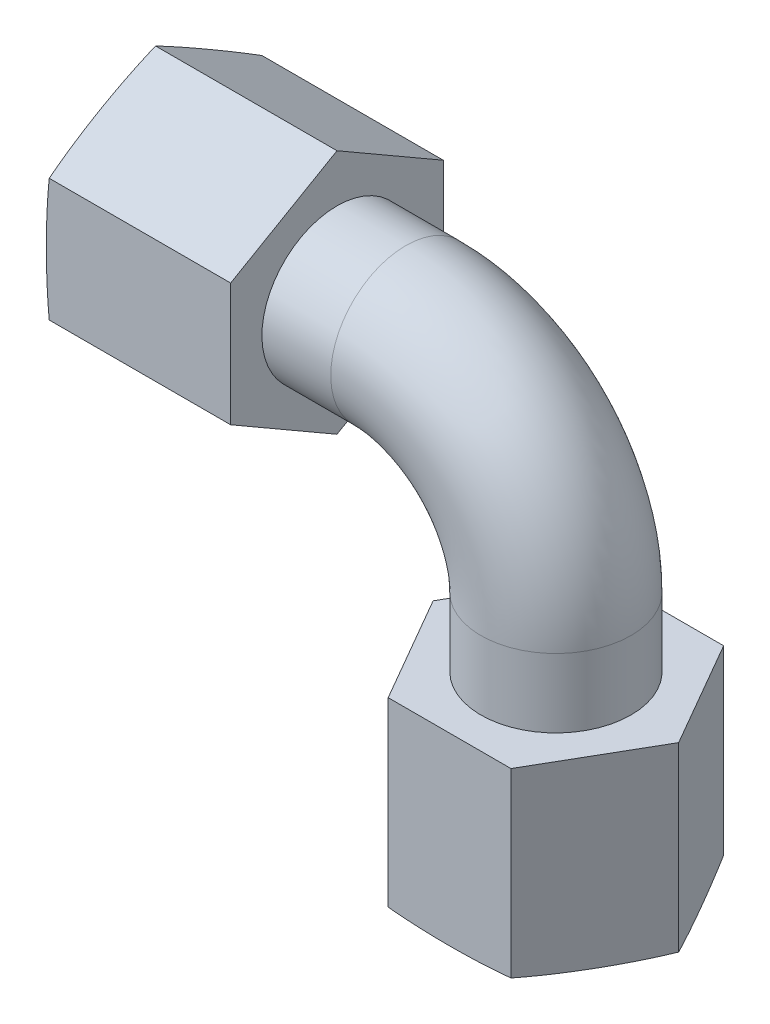
ISO-10303-21;
HEADER;
FILE_DESCRIPTION(('STEP AP214'),'2;1');
FILE_NAME('part.step','',(''),(''),'','','');
FILE_SCHEMA(('AUTOMOTIVE_DESIGN { 1 0 10303 214 1 1 1 1 }'));
ENDSEC;
DATA;
#1=APPLICATION_CONTEXT('core data for automotive mechanical design processes');
#2=APPLICATION_PROTOCOL_DEFINITION('international standard','automotive_design',2000,#1);
#3=PRODUCT_CONTEXT('',#1,'mechanical');
#4=PRODUCT('Part','Part','',(#3));
#5=PRODUCT_RELATED_PRODUCT_CATEGORY('part','',(#4));
#6=PRODUCT_DEFINITION_FORMATION('','',#4);
#7=PRODUCT_DEFINITION_CONTEXT('part definition',#1,'design');
#8=PRODUCT_DEFINITION('design','',#6,#7);
#9=PRODUCT_DEFINITION_SHAPE('','',#8);
#10=(LENGTH_UNIT() NAMED_UNIT(*) SI_UNIT(.MILLI.,.METRE.));
#11=(NAMED_UNIT(*) PLANE_ANGLE_UNIT() SI_UNIT($,.RADIAN.));
#12=(NAMED_UNIT(*) SI_UNIT($,.STERADIAN.) SOLID_ANGLE_UNIT());
#13=UNCERTAINTY_MEASURE_WITH_UNIT(LENGTH_MEASURE(1.E-05),#10,'distance_accuracy_value','');
#14=(GEOMETRIC_REPRESENTATION_CONTEXT(3) GLOBAL_UNCERTAINTY_ASSIGNED_CONTEXT((#13)) GLOBAL_UNIT_ASSIGNED_CONTEXT((#10,
#11,#12)) REPRESENTATION_CONTEXT('',''));
#15=CARTESIAN_POINT('',(0.,0.,0.));
#16=DIRECTION('',(0.,0.,1.));
#17=DIRECTION('',(1.,0.,0.));
#18=AXIS2_PLACEMENT_3D('',#15,#16,#17);
#19=CARTESIAN_POINT('',(2191.30773802744,1656.73988100521,8.77453151862028));
#20=DIRECTION('',(1.,0.,0.));
#21=DIRECTION('',(0.,1.,0.));
#22=AXIS2_PLACEMENT_3D('',#19,#20,#21);
#23=PLANE('',#22);
#24=CARTESIAN_POINT('',(2191.30773802744,1662.48988100521,8.77453151862028));
#25=DIRECTION('',(-1.,0.,0.));
#26=DIRECTION('',(0.,-1.,0.));
#27=AXIS2_PLACEMENT_3D('',#24,#25,#26);
#28=CIRCLE('',#27,4.);
#29=CARTESIAN_POINT('',(2191.30773802744,1658.48988100521,8.77453151862028));
#30=VERTEX_POINT('',#29);
#31=EDGE_CURVE('E620',#30,#30,#28,.T.);
#32=ORIENTED_EDGE('',*,*,#31,.T.);
#33=EDGE_LOOP('',(#32));
#34=FACE_BOUND('',#33,.T.);
#35=ADVANCED_FACE('F16',(#34),#23,.F.);
#36=CARTESIAN_POINT('',(2197.08303449311,1644.98988100521,8.77453151862028));
#37=DIRECTION('',(0.,1.,0.));
#38=DIRECTION('',(0.,0.,1.));
#39=AXIS2_PLACEMENT_3D('',#36,#37,#38);
#40=PLANE('',#39);
#41=CARTESIAN_POINT('',(2208.80773802744,1644.98988100521,8.77453151862028));
#42=DIRECTION('',(0.,1.,0.));
#43=DIRECTION('',(-1.,0.,0.));
#44=AXIS2_PLACEMENT_3D('',#41,#42,#43);
#45=CIRCLE('',#44,4.);
#46=CARTESIAN_POINT('',(2204.80773802744,1644.98988100521,8.77453151862028));
#47=VERTEX_POINT('',#46);
#48=EDGE_CURVE('E621',#47,#47,#45,.F.);
#49=ORIENTED_EDGE('',*,*,#48,.T.);
#50=EDGE_LOOP('',(#49));
#51=FACE_BOUND('',#50,.T.);
#52=ADVANCED_FACE('F582',(#51),#40,.F.);
#53=CARTESIAN_POINT('',(2191.30773802744,1662.48988100521,8.77453151862028));
#54=DIRECTION('',(-1.,0.,0.));
#55=DIRECTION('',(0.,-1.,0.));
#56=AXIS2_PLACEMENT_3D('',#53,#54,#55);
#57=CYLINDRICAL_SURFACE('',#56,4.);
#58=ORIENTED_EDGE('',*,*,#31,.F.);
#59=EDGE_LOOP('',(#58));
#60=FACE_BOUND('',#59,.T.);
#61=CARTESIAN_POINT('',(2176.30773802744,1662.48988100521,8.77453151862028));
#62=DIRECTION('',(-1.,0.,0.));
#63=DIRECTION('',(0.,-1.,0.));
#64=AXIS2_PLACEMENT_3D('',#61,#62,#63);
#65=CIRCLE('',#64,4.);
#66=CARTESIAN_POINT('',(2176.30773802744,1658.48988100521,8.77453151862028));
#67=VERTEX_POINT('',#66);
#68=EDGE_CURVE('E624',#67,#67,#65,.F.);
#69=ORIENTED_EDGE('',*,*,#68,.F.);
#70=EDGE_LOOP('',(#69));
#71=FACE_BOUND('',#70,.T.);
#72=ADVANCED_FACE('F573',(#60,#71),#57,.F.);
#73=CARTESIAN_POINT('',(2208.80773802744,1644.98988100521,8.77453151862028));
#74=DIRECTION('',(0.,1.,0.));
#75=DIRECTION('',(-1.,0.,0.));
#76=AXIS2_PLACEMENT_3D('',#73,#74,#75);
#77=CYLINDRICAL_SURFACE('',#76,4.);
#78=CARTESIAN_POINT('',(2208.80773802744,1629.98988100521,8.77453151862028));
#79=DIRECTION('',(0.,1.,0.));
#80=DIRECTION('',(-1.,0.,0.));
#81=AXIS2_PLACEMENT_3D('',#78,#79,#80);
#82=CIRCLE('',#81,4.);
#83=CARTESIAN_POINT('',(2204.80773802744,1629.98988100521,8.77453151862028));
#84=VERTEX_POINT('',#83);
#85=EDGE_CURVE('E645',#84,#84,#82,.T.);
#86=ORIENTED_EDGE('',*,*,#85,.F.);
#87=EDGE_LOOP('',(#86));
#88=FACE_BOUND('',#87,.T.);
#89=ORIENTED_EDGE('',*,*,#48,.F.);
#90=EDGE_LOOP('',(#89));
#91=FACE_BOUND('',#90,.T.);
#92=ADVANCED_FACE('F564',(#88,#91),#77,.F.);
#93=CARTESIAN_POINT('',(2176.30773802744,1662.48988100521,8.77453151862028));
#94=DIRECTION('',(-1.,0.,0.));
#95=DIRECTION('',(0.,-1.,0.));
#96=AXIS2_PLACEMENT_3D('',#93,#94,#95);
#97=PLANE('',#96);
#98=ORIENTED_EDGE('',*,*,#68,.T.);
#99=EDGE_LOOP('',(#98));
#100=FACE_BOUND('',#99,.T.);
#101=CARTESIAN_POINT('',(2176.30773802744,1662.48988100521,8.77453151862028));
#102=DIRECTION('',(1.,0.,0.));
#103=DIRECTION('',(0.,1.,0.));
#104=AXIS2_PLACEMENT_3D('',#101,#102,#103);
#105=CIRCLE('',#104,5.31495457622366);
#106=CARTESIAN_POINT('',(2176.30773802744,1657.17492642898,8.77453151862046));
#107=VERTEX_POINT('',#106);
#108=CARTESIAN_POINT('',(2176.30773802744,1667.80483558143,8.77453151862028));
#109=VERTEX_POINT('',#108);
#110=EDGE_CURVE('E642',#107,#109,#105,.F.);
#111=ORIENTED_EDGE('',*,*,#110,.T.);
#112=CARTESIAN_POINT('',(2176.30773802744,1662.48988100521,8.77453151862028));
#113=DIRECTION('',(1.,0.,0.));
#114=DIRECTION('',(0.,-1.,0.));
#115=AXIS2_PLACEMENT_3D('',#112,#113,#114);
#116=CIRCLE('',#115,5.31495457622344);
#117=EDGE_CURVE('E641',#109,#107,#116,.F.);
#118=ORIENTED_EDGE('',*,*,#117,.T.);
#119=EDGE_LOOP('',(#111,#118));
#120=FACE_BOUND('',#119,.T.);
#121=ADVANCED_FACE('F556',(#100,#120),#97,.T.);
#122=CARTESIAN_POINT('',(2208.80773802744,1629.98988100521,8.77453151862028));
#123=DIRECTION('',(0.,-1.,0.));
#124=DIRECTION('',(1.,0.,0.));
#125=AXIS2_PLACEMENT_3D('',#122,#123,#124);
#126=PLANE('',#125);
#127=ORIENTED_EDGE('',*,*,#85,.T.);
#128=EDGE_LOOP('',(#127));
#129=FACE_BOUND('',#128,.T.);
#130=CARTESIAN_POINT('',(2208.80773802744,1629.98988100521,8.77453151862028));
#131=DIRECTION('',(0.,1.,0.));
#132=DIRECTION('',(-1.,0.,0.));
#133=AXIS2_PLACEMENT_3D('',#130,#131,#132);
#134=CIRCLE('',#133,5.31495457622366);
#135=CARTESIAN_POINT('',(2214.12269260366,1629.98988100521,8.77453151862035));
#136=VERTEX_POINT('',#135);
#137=CARTESIAN_POINT('',(2203.49278345122,1629.98988100521,8.77453151862046));
#138=VERTEX_POINT('',#137);
#139=EDGE_CURVE('E126',#136,#138,#134,.F.);
#140=ORIENTED_EDGE('',*,*,#139,.T.);
#141=CARTESIAN_POINT('',(2208.80773802744,1629.98988100521,8.77453151862028));
#142=DIRECTION('',(0.,1.,0.));
#143=DIRECTION('',(1.,0.,0.));
#144=AXIS2_PLACEMENT_3D('',#141,#142,#143);
#145=CIRCLE('',#144,5.31495457622322);
#146=EDGE_CURVE('E631',#138,#136,#145,.F.);
#147=ORIENTED_EDGE('',*,*,#146,.T.);
#148=EDGE_LOOP('',(#140,#147));
#149=FACE_BOUND('',#148,.T.);
#150=ADVANCED_FACE('F222',(#129,#149),#126,.T.);
#151=CARTESIAN_POINT('',(2201.4047595833,1657.68570660186,8.77453151862028));
#152=DIRECTION('',(0.,0.,-1.));
#153=DIRECTION('',(0.,-1.,0.));
#154=AXIS2_PLACEMENT_3D('',#151,#152,#153);
#155=CIRCLE('',#154,25.1022187736506);
#156=TRIMMED_CURVE('',#155,(PARAMETER_VALUE(-1.76336880600803)),
(PARAMETER_VALUE(1.76336880600805)),.T.,.PARAMETER.);
#157=CARTESIAN_POINT('',(2201.4047595833,1662.48988100521,8.77453151862028));
#158=DIRECTION('',(-1.,0.,0.));
#159=AXIS1_PLACEMENT('',#157,#158);
#160=SURFACE_OF_REVOLUTION('',#156,#159);
#161=ORIENTED_EDGE('',*,*,#110,.F.);
#162=ORIENTED_EDGE('',*,*,#117,.F.);
#163=EDGE_LOOP('',(#161,#162));
#164=FACE_BOUND('',#163,.T.);
#165=CARTESIAN_POINT('',(2176.80773802744,1652.67492642899,8.77453151862075));
#166=CARTESIAN_POINT('',(2176.76522400836,1652.88372426442,8.41288305914125));
#167=CARTESIAN_POINT('',(2176.72945122882,1653.09284079154,8.05068260945429));
#168=CARTESIAN_POINT('',(2176.66992359423,1653.51146284025,7.32560795192809));
#169=CARTESIAN_POINT('',(2176.64616635151,1653.72096827623,6.96273389234122));
#170=CARTESIAN_POINT('',(2176.60923112416,1654.13973103752,6.23741551347061));
#171=CARTESIAN_POINT('',(2176.59602944363,1654.3489878596,5.87497206579601));
#172=CARTESIAN_POINT('',(2176.57909900616,1654.76761320342,5.14989170097483));
#173=CARTESIAN_POINT('',(2176.57537104585,1654.97698173306,4.78725477012275));
#174=CARTESIAN_POINT('',(2176.57702628768,1655.38611804952,4.07860988279533));
#175=CARTESIAN_POINT('',(2176.58199992867,1655.58588627245,3.73260117095429));
#176=CARTESIAN_POINT('',(2176.60067445799,1655.98530518785,3.04078731597354));
#177=CARTESIAN_POINT('',(2176.61437457738,1656.18495588913,2.69498215758475));
#178=CARTESIAN_POINT('',(2176.65147794116,1656.58446921215,2.00300478381755));
#179=CARTESIAN_POINT('',(2176.6749019882,1656.78433136634,1.6568333782484));
#180=CARTESIAN_POINT('',(2176.73274785697,1657.18369434716,0.965116404812906));
#181=CARTESIAN_POINT('',(2176.76717186569,1657.38319509399,0.619570975152987));
#182=CARTESIAN_POINT('',(2176.80773802744,1657.5824037171,0.27453151862084));
#183=B_SPLINE_CURVE_WITH_KNOTS('',3,(#165,#166,#167,#168,#169,#170,#171,#172,#173,#174,#175,
#176,#177,#178,#179,#180,#181,#182),.UNSPECIFIED.,.F.,.F.,(4,2,2,2,2,2,2,2,4),(0.,
1.25913729415697,2.51802428019885,3.77407722793103,5.03023579276556,6.22884943043978,
7.42735746790678,8.62844282993661,9.82976713873556),.UNSPECIFIED.);
#184=CARTESIAN_POINT('',(2176.80773802744,1652.67492642898,8.77453151862048));
#185=VERTEX_POINT('',#184);
#186=CARTESIAN_POINT('',(2176.80773802744,1657.5824037171,0.274531518620571));
#187=VERTEX_POINT('',#186);
#188=EDGE_CURVE('E135',#185,#187,#183,.T.);
#189=ORIENTED_EDGE('',*,*,#188,.F.);
#190=CARTESIAN_POINT('',(2176.80773802744,1657.5824037171,17.2745315186204));
#191=CARTESIAN_POINT('',(2176.76522400836,1657.37360588166,16.9128830591409));
#192=CARTESIAN_POINT('',(2176.72945122882,1657.16448935454,16.5506826094539));
#193=CARTESIAN_POINT('',(2176.66992359423,1656.74586730583,15.8256079519277));
#194=CARTESIAN_POINT('',(2176.64616635151,1656.53636186985,15.4627338923409));
#195=CARTESIAN_POINT('',(2176.60923112416,1656.11759910856,14.7374155134704));
#196=CARTESIAN_POINT('',(2176.59602944363,1655.90834228648,14.3749720657958));
#197=CARTESIAN_POINT('',(2176.57909900616,1655.48971694266,13.6498917009746));
#198=CARTESIAN_POINT('',(2176.57537104585,1655.28034841302,13.2872547701224));
#199=CARTESIAN_POINT('',(2176.57702628768,1654.87121209656,12.578609882795));
#200=CARTESIAN_POINT('',(2176.58199992867,1654.67144387364,12.2326011709541));
#201=CARTESIAN_POINT('',(2176.60067445799,1654.27202495823,11.5407873159733));
#202=CARTESIAN_POINT('',(2176.61437457738,1654.07237425695,11.1949821575844));
#203=CARTESIAN_POINT('',(2176.65147794116,1653.67286093393,10.5030047838171));
#204=CARTESIAN_POINT('',(2176.6749019882,1653.47299877974,10.156833378248));
#205=CARTESIAN_POINT('',(2176.73274785697,1653.07363579893,9.46511640481246));
#206=CARTESIAN_POINT('',(2176.76717186569,1652.87413505209,9.11957097515253));
#207=CARTESIAN_POINT('',(2176.80773802744,1652.67492642898,8.77453151862037));
#208=B_SPLINE_CURVE_WITH_KNOTS('',3,(#190,#191,#192,#193,#194,#195,#196,#197,#198,#199,#200,
#201,#202,#203,#204,#205,#206,#207),.UNSPECIFIED.,.F.,.F.,(4,2,2,2,2,2,2,2,4),(0.,
1.25913729415698,2.51802428019875,3.77407722793087,5.03023579276542,6.22884943043958,
7.42735746790682,8.62844282993664,9.82976713873575),.UNSPECIFIED.);
#209=CARTESIAN_POINT('',(2176.80773802744,1657.5824037171,17.2745315186203));
#210=VERTEX_POINT('',#209);
#211=EDGE_CURVE('E247',#210,#185,#208,.T.);
#212=ORIENTED_EDGE('',*,*,#211,.F.);
#213=CARTESIAN_POINT('',(2176.80773802744,1667.39735829332,17.2745315186202));
#214=CARTESIAN_POINT('',(2176.76522400836,1666.97976262245,17.2745315186203));
#215=CARTESIAN_POINT('',(2176.72945122882,1666.5615295682,17.2745315186203));
#216=CARTESIAN_POINT('',(2176.66992359423,1665.72428547079,17.2745315186203));
#217=CARTESIAN_POINT('',(2176.64616635151,1665.30527459882,17.2745315186203));
#218=CARTESIAN_POINT('',(2176.60923112416,1664.46774907624,17.2745315186203));
#219=CARTESIAN_POINT('',(2176.59602944363,1664.04923543208,17.2745315186203));
#220=CARTESIAN_POINT('',(2176.57909900616,1663.21198474445,17.2745315186203));
#221=CARTESIAN_POINT('',(2176.57537104585,1662.79324768516,17.2745315186203));
#222=CARTESIAN_POINT('',(2176.57702628768,1661.97497505224,17.2745315186203));
#223=CARTESIAN_POINT('',(2176.58199992867,1661.5754386064,17.2745315186203));
#224=CARTESIAN_POINT('',(2176.60067445799,1660.77660077559,17.2745315186203));
#225=CARTESIAN_POINT('',(2176.61437457738,1660.37729937303,17.2745315186203));
#226=CARTESIAN_POINT('',(2176.65147794116,1659.57827272699,17.2745315186203));
#227=CARTESIAN_POINT('',(2176.6749019882,1659.17854841861,17.2745315186203));
#228=CARTESIAN_POINT('',(2176.73274785697,1658.37982245698,17.2745315186203));
#229=CARTESIAN_POINT('',(2176.76717186569,1657.98082096332,17.2745315186202));
#230=CARTESIAN_POINT('',(2176.80773802744,1657.5824037171,17.2745315186201));
#231=B_SPLINE_CURVE_WITH_KNOTS('',3,(#213,#214,#215,#216,#217,#218,#219,#220,#221,#222,#223,
#224,#225,#226,#227,#228,#229,#230),.UNSPECIFIED.,.F.,.F.,(4,2,2,2,2,2,2,2,4),(0.,
1.25913729415702,2.51802428019896,3.77407722793127,5.0302357927657,6.22884943043954,
7.42735746790609,8.62844282993539,9.82976713873412),.UNSPECIFIED.);
#232=CARTESIAN_POINT('',(2176.80773802744,1667.39735829332,17.2745315186203));
#233=VERTEX_POINT('',#232);
#234=EDGE_CURVE('E241',#233,#210,#231,.T.);
#235=ORIENTED_EDGE('',*,*,#234,.F.);
#236=CARTESIAN_POINT('',(2176.80773802744,1672.30483558143,8.7745315186204));
#237=CARTESIAN_POINT('',(2176.76522400836,1672.096037746,9.1361799780999));
#238=CARTESIAN_POINT('',(2176.72945122882,1671.88692121887,9.49838042778687));
#239=CARTESIAN_POINT('',(2176.66992359423,1671.46829917017,10.2234550853131));
#240=CARTESIAN_POINT('',(2176.64616635151,1671.25879373418,10.5863291448999));
#241=CARTESIAN_POINT('',(2176.60923112416,1670.84003097289,11.3116475237705));
#242=CARTESIAN_POINT('',(2176.59602944363,1670.63077415081,11.6740909714451));
#243=CARTESIAN_POINT('',(2176.57909900616,1670.212148807,12.3991713362663));
#244=CARTESIAN_POINT('',(2176.57537104585,1670.00278027735,12.7618082671185));
#245=CARTESIAN_POINT('',(2176.57702628768,1669.59364396089,13.4704531544458));
#246=CARTESIAN_POINT('',(2176.58199992867,1669.39387573797,13.8164618662868));
#247=CARTESIAN_POINT('',(2176.60067445799,1668.99445682257,14.5082757212676));
#248=CARTESIAN_POINT('',(2176.61437457738,1668.79480612129,14.8540808796564));
#249=CARTESIAN_POINT('',(2176.65147794116,1668.39529279827,15.5460582534236));
#250=CARTESIAN_POINT('',(2176.6749019882,1668.19543064408,15.8922296589927));
#251=CARTESIAN_POINT('',(2176.73274785697,1667.79606766326,16.5839466324282));
#252=CARTESIAN_POINT('',(2176.76717186569,1667.59656691643,16.9294920620881));
#253=CARTESIAN_POINT('',(2176.80773802744,1667.39735829332,17.2745315186203));
#254=B_SPLINE_CURVE_WITH_KNOTS('',3,(#236,#237,#238,#239,#240,#241,#242,#243,#244,#245,#246,
#247,#248,#249,#250,#251,#252,#253),.UNSPECIFIED.,.F.,.F.,(4,2,2,2,2,2,2,2,4),(0.,
1.25913729415702,2.5180242801988,3.77407722793105,5.0302357927655,6.22884943043961,
7.42735746790682,8.6284428299366,9.82976713873555),.UNSPECIFIED.);
#255=CARTESIAN_POINT('',(2176.80773802744,1672.30483558143,8.77453151862034));
#256=VERTEX_POINT('',#255);
#257=EDGE_CURVE('E123',#256,#233,#254,.T.);
#258=ORIENTED_EDGE('',*,*,#257,.F.);
#259=CARTESIAN_POINT('',(2176.80773802744,1667.39735829332,0.274531518620019));
#260=CARTESIAN_POINT('',(2176.76522400836,1667.60615612875,0.636179978099561));
#261=CARTESIAN_POINT('',(2176.72945122882,1667.81527265588,0.99838042778656));
#262=CARTESIAN_POINT('',(2176.66992359423,1668.23389470459,1.72345508531276));
#263=CARTESIAN_POINT('',(2176.64616635151,1668.44340014057,2.0863291448996));
#264=CARTESIAN_POINT('',(2176.60923112416,1668.86216290186,2.81164752377012));
#265=CARTESIAN_POINT('',(2176.59602944363,1669.07141972394,3.17409097144466));
#266=CARTESIAN_POINT('',(2176.57909900616,1669.49004506775,3.89917133626584));
#267=CARTESIAN_POINT('',(2176.57537104585,1669.6994135974,4.26180826711798));
#268=CARTESIAN_POINT('',(2176.57702628768,1670.10854991386,4.97045315444545));
#269=CARTESIAN_POINT('',(2176.58199992867,1670.30831813678,5.3164618662865));
#270=CARTESIAN_POINT('',(2176.60067445799,1670.70773705218,6.00827572126724));
#271=CARTESIAN_POINT('',(2176.61437457738,1670.90738775347,6.35408087965603));
#272=CARTESIAN_POINT('',(2176.65147794116,1671.30690107648,7.04605825342326));
#273=CARTESIAN_POINT('',(2176.6749019882,1671.50676323067,7.39222965899244));
#274=CARTESIAN_POINT('',(2176.73274785697,1671.90612621149,8.08394663242805));
#275=CARTESIAN_POINT('',(2176.76717186569,1672.10562695832,8.42949206208804));
#276=CARTESIAN_POINT('',(2176.80773802744,1672.30483558143,8.77453151862023));
#277=B_SPLINE_CURVE_WITH_KNOTS('',3,(#259,#260,#261,#262,#263,#264,#265,#266,#267,#268,#269,
#270,#271,#272,#273,#274,#275,#276),.UNSPECIFIED.,.F.,.F.,(4,2,2,2,2,2,2,2,4),(0.,
1.25913729415706,2.51802428019885,3.77407722793094,5.03023579276543,6.22884943043967,
7.4273574679068,8.62844282993671,9.82976713873582),.UNSPECIFIED.);
#278=CARTESIAN_POINT('',(2176.80773802744,1667.39735829332,0.274531518620149));
#279=VERTEX_POINT('',#278);
#280=EDGE_CURVE('E116',#279,#256,#277,.T.);
#281=ORIENTED_EDGE('',*,*,#280,.F.);
#282=CARTESIAN_POINT('',(2176.80773802744,1657.5824037171,0.274531518620414));
#283=CARTESIAN_POINT('',(2176.76522400836,1657.99999938796,0.274531518620332));
#284=CARTESIAN_POINT('',(2176.72945122882,1658.41823244222,0.274531518620294));
#285=CARTESIAN_POINT('',(2176.66992359423,1659.25547653963,0.274531518620263));
#286=CARTESIAN_POINT('',(2176.64616635151,1659.6744874116,0.27453151862027));
#287=CARTESIAN_POINT('',(2176.60923112416,1660.51201293417,0.274531518620287));
#288=CARTESIAN_POINT('',(2176.59602944363,1660.93052657834,0.274531518620297));
#289=CARTESIAN_POINT('',(2176.57909900616,1661.76777726596,0.27453151862026));
#290=CARTESIAN_POINT('',(2176.57537104585,1662.18651432525,0.274531518620213));
#291=CARTESIAN_POINT('',(2176.57702628768,1663.00478695817,0.274531518620216));
#292=CARTESIAN_POINT('',(2176.58199992867,1663.40432340402,0.274531518620262));
#293=CARTESIAN_POINT('',(2176.60067445799,1664.20316123482,0.274531518620295));
#294=CARTESIAN_POINT('',(2176.61437457738,1664.60246263739,0.274531518620282));
#295=CARTESIAN_POINT('',(2176.65147794116,1665.40148928342,0.274531518620274));
#296=CARTESIAN_POINT('',(2176.6749019882,1665.8012135918,0.274531518620278));
#297=CARTESIAN_POINT('',(2176.73274785697,1666.59993955344,0.274531518620278));
#298=CARTESIAN_POINT('',(2176.76717186569,1666.9989410471,0.274531518620274));
#299=CARTESIAN_POINT('',(2176.80773802744,1667.39735829332,0.274531518620252));
#300=B_SPLINE_CURVE_WITH_KNOTS('',3,(#282,#283,#284,#285,#286,#287,#288,#289,#290,#291,#292,
#293,#294,#295,#296,#297,#298,#299),.UNSPECIFIED.,.F.,.F.,(4,2,2,2,2,2,2,2,4),(0.,
1.25913729415721,2.51802428019872,3.77407722793104,5.03023579276547,6.22884943043931,
7.42735746790652,8.62844282993627,9.82976713873544),.UNSPECIFIED.);
#301=EDGE_CURVE('E120',#187,#279,#300,.T.);
#302=ORIENTED_EDGE('',*,*,#301,.F.);
#303=EDGE_LOOP('',(#189,#212,#235,#258,#281,#302));
#304=FACE_BOUND('',#303,.T.);
#305=ADVANCED_FACE('F118',(#164,#304),#160,.T.);
#306=CARTESIAN_POINT('',(2204.00356362409,1655.08690256107,8.77453151862028));
#307=DIRECTION('',(0.,0.,1.));
#308=DIRECTION('',(-1.,0.,0.));
#309=AXIS2_PLACEMENT_3D('',#306,#307,#308);
#310=CIRCLE('',#309,25.1022187736506);
#311=TRIMMED_CURVE('',#310,(PARAMETER_VALUE(-1.76336880600805)),
(PARAMETER_VALUE(1.76336880600805)),.T.,.PARAMETER.);
#312=CARTESIAN_POINT('',(2208.80773802744,1655.08690256107,8.77453151862028));
#313=DIRECTION('',(0.,-1.,0.));
#314=AXIS1_PLACEMENT('',#312,#313);
#315=SURFACE_OF_REVOLUTION('',#311,#314);
#316=CARTESIAN_POINT('',(2198.99278345121,1630.48988100521,8.77453151862018));
#317=CARTESIAN_POINT('',(2199.20158128665,1630.44736698613,9.13617997809975));
#318=CARTESIAN_POINT('',(2199.41069781377,1630.41159420659,9.49838042778669));
#319=CARTESIAN_POINT('',(2199.82931986248,1630.352066572,10.2234550853128));
#320=CARTESIAN_POINT('',(2200.03882529846,1630.32830932928,10.5863291448996));
#321=CARTESIAN_POINT('',(2200.45758805975,1630.29137410193,11.3116475237701));
#322=CARTESIAN_POINT('',(2200.66684488183,1630.2781724214,11.6740909714447));
#323=CARTESIAN_POINT('',(2201.08547022565,1630.26124198393,12.3991713362659));
#324=CARTESIAN_POINT('',(2201.29483875529,1630.25751402363,12.7618082671182));
#325=CARTESIAN_POINT('',(2201.70397507175,1630.25916926545,13.4704531544456));
#326=CARTESIAN_POINT('',(2201.90374329468,1630.26414290644,13.8164618662865));
#327=CARTESIAN_POINT('',(2202.30316221008,1630.28281743576,14.5082757212673));
#328=CARTESIAN_POINT('',(2202.50281291136,1630.29651755516,14.8540808796563));
#329=CARTESIAN_POINT('',(2202.90232623438,1630.33362091893,15.5460582534236));
#330=CARTESIAN_POINT('',(2203.10218838857,1630.35704496598,15.8922296589927));
#331=CARTESIAN_POINT('',(2203.50155136939,1630.41489083475,16.5839466324282));
#332=CARTESIAN_POINT('',(2203.70105211622,1630.44931484347,16.9294920620881));
#333=CARTESIAN_POINT('',(2203.90026073933,1630.48988100521,17.2745315186205));
#334=B_SPLINE_CURVE_WITH_KNOTS('',3,(#316,#317,#318,#319,#320,#321,#322,#323,#324,#325,#326,
#327,#328,#329,#330,#331,#332,#333),.UNSPECIFIED.,.F.,.F.,(4,2,2,2,2,2,2,2,4),(0.,
1.25913729415684,2.51802428019878,3.7740772279307,5.03023579276534,6.22884943043973,
7.42735746790674,8.62844282993679,9.82976713873584),.UNSPECIFIED.);
#335=CARTESIAN_POINT('',(2198.99278345121,1630.48988100521,8.77453151862042));
#336=VERTEX_POINT('',#335);
#337=CARTESIAN_POINT('',(2203.90026073933,1630.48988100521,17.2745315186203));
#338=VERTEX_POINT('',#337);
#339=EDGE_CURVE('E282',#336,#338,#334,.T.);
#340=ORIENTED_EDGE('',*,*,#339,.F.);
#341=CARTESIAN_POINT('',(2203.90026073933,1630.48988100521,0.27453151862047));
#342=CARTESIAN_POINT('',(2203.69146290389,1630.44736698613,0.636179978099775));
#343=CARTESIAN_POINT('',(2203.48234637677,1630.41159420659,0.998380427786707));
#344=CARTESIAN_POINT('',(2203.06372432806,1630.352066572,1.72345508531293));
#345=CARTESIAN_POINT('',(2202.85421889208,1630.32830932928,2.08632914489986));
#346=CARTESIAN_POINT('',(2202.43545613079,1630.29137410193,2.81164752377048));
#347=CARTESIAN_POINT('',(2202.22619930871,1630.2781724214,3.17409097144505));
#348=CARTESIAN_POINT('',(2201.80757396489,1630.26124198393,3.89917133626624));
#349=CARTESIAN_POINT('',(2201.59820543525,1630.25751402363,4.26180826711836));
#350=CARTESIAN_POINT('',(2201.18906911879,1630.25916926545,4.97045315444587));
#351=CARTESIAN_POINT('',(2200.98930089587,1630.26414290644,5.31646186628697));
#352=CARTESIAN_POINT('',(2200.58988198046,1630.28281743576,6.00827572126773));
#353=CARTESIAN_POINT('',(2200.39023127918,1630.29651755516,6.3540808796565));
#354=CARTESIAN_POINT('',(2199.99071795616,1630.33362091893,7.04605825342369));
#355=CARTESIAN_POINT('',(2199.79085580197,1630.35704496597,7.39222965899286));
#356=CARTESIAN_POINT('',(2199.39149282116,1630.41489083475,8.08394663242843));
#357=CARTESIAN_POINT('',(2199.19199207432,1630.44931484347,8.4294920620884));
#358=CARTESIAN_POINT('',(2198.99278345121,1630.48988100521,8.77453151862066));
#359=B_SPLINE_CURVE_WITH_KNOTS('',3,(#341,#342,#343,#344,#345,#346,#347,#348,#349,#350,#351,
#352,#353,#354,#355,#356,#357,#358),.UNSPECIFIED.,.F.,.F.,(4,2,2,2,2,2,2,2,4),(0.,
1.25913729415689,2.51802428019871,3.77407722793104,5.03023579276549,6.22884943043983,
7.42735746790688,8.62844282993693,9.82976713873593),.UNSPECIFIED.);
#360=CARTESIAN_POINT('',(2203.90026073933,1630.48988100521,0.274531518620375));
#361=VERTEX_POINT('',#360);
#362=EDGE_CURVE('E291',#361,#336,#359,.T.);
#363=ORIENTED_EDGE('',*,*,#362,.F.);
#364=CARTESIAN_POINT('',(2213.71521531555,1630.48988100521,0.274531518620169));
#365=CARTESIAN_POINT('',(2213.29761964469,1630.44736698613,0.274531518620232));
#366=CARTESIAN_POINT('',(2212.87938659043,1630.41159420659,0.274531518620265));
#367=CARTESIAN_POINT('',(2212.04214249302,1630.352066572,0.274531518620294));
#368=CARTESIAN_POINT('',(2211.62313162105,1630.32830932928,0.27453151862029));
#369=CARTESIAN_POINT('',(2210.78560609847,1630.29137410193,0.274531518620269));
#370=CARTESIAN_POINT('',(2210.36709245431,1630.2781724214,0.274531518620253));
#371=CARTESIAN_POINT('',(2209.52984176668,1630.26124198393,0.274531518620306));
#372=CARTESIAN_POINT('',(2209.11110470739,1630.25751402363,0.274531518620376));
#373=CARTESIAN_POINT('',(2208.29283207448,1630.25916926545,0.274531518620372));
#374=CARTESIAN_POINT('',(2207.89329562863,1630.26414290644,0.274531518620305));
#375=CARTESIAN_POINT('',(2207.09445779782,1630.28281743576,0.274531518620253));
#376=CARTESIAN_POINT('',(2206.69515639526,1630.29651755516,0.274531518620269));
#377=CARTESIAN_POINT('',(2205.89612974922,1630.33362091893,0.27453151862029));
#378=CARTESIAN_POINT('',(2205.49640544084,1630.35704496598,0.274531518620296));
#379=CARTESIAN_POINT('',(2204.69767947921,1630.41489083475,0.274531518620262));
#380=CARTESIAN_POINT('',(2204.29867798555,1630.44931484347,0.274531518620223));
#381=CARTESIAN_POINT('',(2203.90026073933,1630.48988100521,0.274531518620141));
#382=B_SPLINE_CURVE_WITH_KNOTS('',3,(#364,#365,#366,#367,#368,#369,#370,#371,#372,#373,#374,
#375,#376,#377,#378,#379,#380,#381),.UNSPECIFIED.,.F.,.F.,(4,2,2,2,2,2,2,2,4),(0.,
1.2591372941568,2.51802428019896,3.77407722793082,5.0302357927657,6.22884943043977,
7.42735746790675,8.62844282993696,9.8297671387359),.UNSPECIFIED.);
#383=CARTESIAN_POINT('',(2213.71521531555,1630.48988100521,0.274531518620351));
#384=VERTEX_POINT('',#383);
#385=EDGE_CURVE('E299',#384,#361,#382,.T.);
#386=ORIENTED_EDGE('',*,*,#385,.F.);
#387=CARTESIAN_POINT('',(2218.62269260366,1630.48988100521,8.7745315186205));
#388=CARTESIAN_POINT('',(2218.41389476823,1630.44736698613,8.41288305914096));
#389=CARTESIAN_POINT('',(2218.2047782411,1630.41159420659,8.05068260945406));
#390=CARTESIAN_POINT('',(2217.7861561924,1630.352066572,7.32560795192801));
#391=CARTESIAN_POINT('',(2217.57665075641,1630.32830932928,6.96273389234121));
#392=CARTESIAN_POINT('',(2217.15788799512,1630.29137410193,6.2374155134707));
#393=CARTESIAN_POINT('',(2216.94863117304,1630.2781724214,5.87497206579612));
#394=CARTESIAN_POINT('',(2216.53000582923,1630.26124198393,5.14989170097478));
#395=CARTESIAN_POINT('',(2216.32063729958,1630.25751402363,4.78725477012252));
#396=CARTESIAN_POINT('',(2215.91150098312,1630.25916926545,4.07860988279506));
#397=CARTESIAN_POINT('',(2215.7117327602,1630.26414290644,3.73260117095413));
#398=CARTESIAN_POINT('',(2215.3123138448,1630.28281743576,3.04078731597342));
#399=CARTESIAN_POINT('',(2215.11266314352,1630.29651755516,2.69498215758453));
#400=CARTESIAN_POINT('',(2214.7131498205,1630.33362091893,2.00300478381717));
#401=CARTESIAN_POINT('',(2214.51328766631,1630.35704496598,1.65683337824797));
#402=CARTESIAN_POINT('',(2214.11392468549,1630.41489083475,0.965116404812473));
#403=CARTESIAN_POINT('',(2213.91442393866,1630.44931484347,0.619570975152619));
#404=CARTESIAN_POINT('',(2213.71521531555,1630.48988100521,0.274531518620483));
#405=B_SPLINE_CURVE_WITH_KNOTS('',3,(#387,#388,#389,#390,#391,#392,#393,#394,#395,#396,#397,
#398,#399,#400,#401,#402,#403,#404),.UNSPECIFIED.,.F.,.F.,(4,2,2,2,2,2,2,2,4),(0.,
1.25913729415675,2.51802428019862,3.77407722793064,5.03023579276535,6.22884943043972,
7.42735746790665,8.62844282993684,9.82976713873578),.UNSPECIFIED.);
#406=CARTESIAN_POINT('',(2218.62269260366,1630.48988100521,8.77453151862056));
#407=VERTEX_POINT('',#406);
#408=EDGE_CURVE('E322',#407,#384,#405,.T.);
#409=ORIENTED_EDGE('',*,*,#408,.F.);
#410=CARTESIAN_POINT('',(2213.71521531555,1630.48988100521,17.2745315186204));
#411=CARTESIAN_POINT('',(2213.92401315098,1630.44736698613,16.9128830591409));
#412=CARTESIAN_POINT('',(2214.13312967811,1630.41159420659,16.550682609454));
#413=CARTESIAN_POINT('',(2214.55175172681,1630.352066572,15.8256079519279));
#414=CARTESIAN_POINT('',(2214.7612571628,1630.32830932928,15.4627338923411));
#415=CARTESIAN_POINT('',(2215.18001992409,1630.29137410193,14.7374155134706));
#416=CARTESIAN_POINT('',(2215.38927674617,1630.2781724214,14.374972065796));
#417=CARTESIAN_POINT('',(2215.80790208998,1630.26124198393,13.6498917009746));
#418=CARTESIAN_POINT('',(2216.01727061963,1630.25751402363,13.2872547701223));
#419=CARTESIAN_POINT('',(2216.42640693609,1630.25916926545,12.5786098827949));
#420=CARTESIAN_POINT('',(2216.62617515901,1630.26414290644,12.2326011709541));
#421=CARTESIAN_POINT('',(2217.02559407441,1630.28281743576,11.5407873159735));
#422=CARTESIAN_POINT('',(2217.2252447757,1630.29651755516,11.1949821575847));
#423=CARTESIAN_POINT('',(2217.62475809871,1630.33362091893,10.5030047838175));
#424=CARTESIAN_POINT('',(2217.8246202529,1630.35704496597,10.1568333782484));
#425=CARTESIAN_POINT('',(2218.22398323372,1630.41489083475,9.46511640481296));
#426=CARTESIAN_POINT('',(2218.42348398055,1630.44931484347,9.11957097515302));
#427=CARTESIAN_POINT('',(2218.62269260366,1630.48988100521,8.77453151862069));
#428=B_SPLINE_CURVE_WITH_KNOTS('',3,(#410,#411,#412,#413,#414,#415,#416,#417,#418,#419,#420,
#421,#422,#423,#424,#425,#426,#427),.UNSPECIFIED.,.F.,.F.,(4,2,2,2,2,2,2,2,4),(0.,
1.25913729415675,2.51802428019865,3.77407722793071,5.03023579276546,6.22884943043962,
7.42735746790637,8.62844282993631,9.8297671387353),.UNSPECIFIED.);
#429=CARTESIAN_POINT('',(2213.71521531555,1630.48988100521,17.2745315186204));
#430=VERTEX_POINT('',#429);
#431=EDGE_CURVE('E331',#430,#407,#428,.T.);
#432=ORIENTED_EDGE('',*,*,#431,.F.);
#433=CARTESIAN_POINT('',(2203.90026073933,1630.48988100521,17.2745315186202));
#434=CARTESIAN_POINT('',(2204.31785641019,1630.44736698613,17.2745315186203));
#435=CARTESIAN_POINT('',(2204.73608946445,1630.41159420659,17.2745315186203));
#436=CARTESIAN_POINT('',(2205.57333356186,1630.352066572,17.2745315186203));
#437=CARTESIAN_POINT('',(2205.99234443383,1630.32830932928,17.2745315186203));
#438=CARTESIAN_POINT('',(2206.8298699564,1630.29137410193,17.2745315186203));
#439=CARTESIAN_POINT('',(2207.24838360057,1630.2781724214,17.2745315186203));
#440=CARTESIAN_POINT('',(2208.08563428819,1630.26124198393,17.2745315186203));
#441=CARTESIAN_POINT('',(2208.50437134748,1630.25751402363,17.2745315186202));
#442=CARTESIAN_POINT('',(2209.3226439804,1630.25916926545,17.2745315186202));
#443=CARTESIAN_POINT('',(2209.72218042625,1630.26414290644,17.2745315186203));
#444=CARTESIAN_POINT('',(2210.52101825705,1630.28281743576,17.2745315186203));
#445=CARTESIAN_POINT('',(2210.92031965962,1630.29651755516,17.2745315186203));
#446=CARTESIAN_POINT('',(2211.71934630565,1630.33362091893,17.2745315186203));
#447=CARTESIAN_POINT('',(2212.11907061404,1630.35704496598,17.2745315186203));
#448=CARTESIAN_POINT('',(2212.91779657567,1630.41489083475,17.2745315186203));
#449=CARTESIAN_POINT('',(2213.31679806933,1630.44931484347,17.2745315186203));
#450=CARTESIAN_POINT('',(2213.71521531555,1630.48988100521,17.2745315186203));
#451=B_SPLINE_CURVE_WITH_KNOTS('',3,(#433,#434,#435,#436,#437,#438,#439,#440,#441,#442,#443,
#444,#445,#446,#447,#448,#449,#450),.UNSPECIFIED.,.F.,.F.,(4,2,2,2,2,2,2,2,4),(0.,
1.25913729415724,2.51802428019895,3.77407722793083,5.03023579276526,6.22884943043933,
7.42735746790631,8.62844282993652,9.82976713873546),.UNSPECIFIED.);
#452=EDGE_CURVE('E275',#338,#430,#451,.T.);
#453=ORIENTED_EDGE('',*,*,#452,.F.);
#454=EDGE_LOOP('',(#340,#363,#386,#409,#432,#453));
#455=FACE_BOUND('',#454,.T.);
#456=ORIENTED_EDGE('',*,*,#146,.F.);
#457=ORIENTED_EDGE('',*,*,#139,.F.);
#458=EDGE_LOOP('',(#456,#457));
#459=FACE_BOUND('',#458,.T.);
#460=ADVANCED_FACE('F172',(#455,#459),#315,.T.);
#461=CARTESIAN_POINT('',(2191.30773802744,1672.30483558143,8.77453151862028));
#462=DIRECTION('',(0.,0.866025403784442,-0.499999999999995));
#463=DIRECTION('',(0.,0.499999999999995,0.866025403784442));
#464=AXIS2_PLACEMENT_3D('',#461,#462,#463);
#465=PLANE('',#464);
#466=DIRECTION('',(0.,-0.500000000000024,-0.866025403784424));
#467=VECTOR('',#466,1.);
#468=CARTESIAN_POINT('',(2191.30773802744,1672.30483558143,8.77453151862028));
#469=LINE('',#468,#467);
#470=CARTESIAN_POINT('',(2191.30773802744,1672.30483558143,8.77453151862007));
#471=VERTEX_POINT('',#470);
#472=CARTESIAN_POINT('',(2191.30773802744,1667.39735829332,0.274531518620286));
#473=VERTEX_POINT('',#472);
#474=EDGE_CURVE('E132',#471,#473,#469,.T.);
#475=ORIENTED_EDGE('',*,*,#474,.T.);
#476=DIRECTION('',(1.,0.,0.));
#477=VECTOR('',#476,1.);
#478=CARTESIAN_POINT('',(2191.30773802744,1667.39735829332,0.274531518620279));
#479=LINE('',#478,#477);
#480=EDGE_CURVE('E129',#279,#473,#479,.T.);
#481=ORIENTED_EDGE('',*,*,#480,.F.);
#482=ORIENTED_EDGE('',*,*,#280,.T.);
#483=DIRECTION('',(1.,0.,0.));
#484=VECTOR('',#483,1.);
#485=CARTESIAN_POINT('',(2191.30773802744,1672.30483558143,8.77453151862008));
#486=LINE('',#485,#484);
#487=EDGE_CURVE('E283',#471,#256,#486,.F.);
#488=ORIENTED_EDGE('',*,*,#487,.F.);
#489=EDGE_LOOP('',(#475,#481,#482,#488));
#490=FACE_BOUND('',#489,.T.);
#491=ADVANCED_FACE('F130',(#490),#465,.T.);
#492=CARTESIAN_POINT('',(2191.30773802744,1667.39735829332,0.274531518620279));
#493=DIRECTION('',(0.,0.,-1.));
#494=DIRECTION('',(0.,1.,0.));
#495=AXIS2_PLACEMENT_3D('',#492,#493,#494);
#496=PLANE('',#495);
#497=DIRECTION('',(0.,-1.,0.));
#498=VECTOR('',#497,1.);
#499=CARTESIAN_POINT('',(2191.30773802744,1662.48988100521,0.274531518620278));
#500=LINE('',#499,#498);
#501=CARTESIAN_POINT('',(2191.30773802744,1657.5824037171,0.27453151862057));
#502=VERTEX_POINT('',#501);
#503=EDGE_CURVE('E209',#473,#502,#500,.T.);
#504=ORIENTED_EDGE('',*,*,#503,.T.);
#505=DIRECTION('',(1.,0.,0.));
#506=VECTOR('',#505,1.);
#507=CARTESIAN_POINT('',(2191.30773802744,1657.5824037171,0.274531518620691));
#508=LINE('',#507,#506);
#509=EDGE_CURVE('E139',#187,#502,#508,.T.);
#510=ORIENTED_EDGE('',*,*,#509,.F.);
#511=ORIENTED_EDGE('',*,*,#301,.T.);
#512=ORIENTED_EDGE('',*,*,#480,.T.);
#513=EDGE_LOOP('',(#504,#510,#511,#512));
#514=FACE_BOUND('',#513,.T.);
#515=ADVANCED_FACE('F137',(#514),#496,.T.);
#516=CARTESIAN_POINT('',(2191.30773802744,1657.5824037171,0.274531518620279));
#517=DIRECTION('',(0.,-0.866025403784442,-0.499999999999995));
#518=DIRECTION('',(0.,0.499999999999995,-0.866025403784442));
#519=AXIS2_PLACEMENT_3D('',#516,#517,#518);
#520=PLANE('',#519);
#521=DIRECTION('',(0.,-0.500000000000041,0.866025403784415));
#522=VECTOR('',#521,1.);
#523=CARTESIAN_POINT('',(2191.30773802744,1657.5824037171,0.274531518620278));
#524=LINE('',#523,#522);
#525=CARTESIAN_POINT('',(2191.30773802744,1652.67492642898,8.77453151862058));
#526=VERTEX_POINT('',#525);
#527=EDGE_CURVE('E694',#502,#526,#524,.T.);
#528=ORIENTED_EDGE('',*,*,#527,.T.);
#529=DIRECTION('',(1.,0.,0.));
#530=VECTOR('',#529,1.);
#531=CARTESIAN_POINT('',(2191.30773802744,1652.67492642898,8.7745315186206));
#532=LINE('',#531,#530);
#533=EDGE_CURVE('E253',#185,#526,#532,.T.);
#534=ORIENTED_EDGE('',*,*,#533,.F.);
#535=ORIENTED_EDGE('',*,*,#188,.T.);
#536=ORIENTED_EDGE('',*,*,#509,.T.);
#537=EDGE_LOOP('',(#528,#534,#535,#536));
#538=FACE_BOUND('',#537,.T.);
#539=ADVANCED_FACE('F166',(#538),#520,.T.);
#540=CARTESIAN_POINT('',(2191.30773802744,1652.67492642898,8.77453151862028));
#541=DIRECTION('',(0.,-0.866025403784442,0.499999999999995));
#542=DIRECTION('',(0.,-0.499999999999995,-0.866025403784442));
#543=AXIS2_PLACEMENT_3D('',#540,#541,#542);
#544=PLANE('',#543);
#545=DIRECTION('',(0.,0.500000000000041,0.866025403784415));
#546=VECTOR('',#545,1.);
#547=CARTESIAN_POINT('',(2191.30773802744,1652.67492642898,8.77453151862028));
#548=LINE('',#547,#546);
#549=CARTESIAN_POINT('',(2191.30773802744,1657.5824037171,17.2745315186203));
#550=VERTEX_POINT('',#549);
#551=EDGE_CURVE('E214',#526,#550,#548,.T.);
#552=ORIENTED_EDGE('',*,*,#551,.T.);
#553=DIRECTION('',(1.,0.,0.));
#554=VECTOR('',#553,1.);
#555=CARTESIAN_POINT('',(2191.30773802744,1657.5824037171,17.2745315186203));
#556=LINE('',#555,#554);
#557=EDGE_CURVE('E382',#210,#550,#556,.T.);
#558=ORIENTED_EDGE('',*,*,#557,.F.);
#559=ORIENTED_EDGE('',*,*,#211,.T.);
#560=ORIENTED_EDGE('',*,*,#533,.T.);
#561=EDGE_LOOP('',(#552,#558,#559,#560));
#562=FACE_BOUND('',#561,.T.);
#563=ADVANCED_FACE('F254',(#562),#544,.T.);
#564=CARTESIAN_POINT('',(2191.30773802744,1657.5824037171,17.2745315186203));
#565=DIRECTION('',(0.,0.,1.));
#566=DIRECTION('',(0.,-1.,0.));
#567=AXIS2_PLACEMENT_3D('',#564,#565,#566);
#568=PLANE('',#567);
#569=DIRECTION('',(0.,-1.,0.));
#570=VECTOR('',#569,1.);
#571=CARTESIAN_POINT('',(2191.30773802744,1662.48988100521,17.2745315186203));
#572=LINE('',#571,#570);
#573=CARTESIAN_POINT('',(2191.30773802744,1667.39735829332,17.2745315186203));
#574=VERTEX_POINT('',#573);
#575=EDGE_CURVE('E205',#550,#574,#572,.F.);
#576=ORIENTED_EDGE('',*,*,#575,.T.);
#577=DIRECTION('',(1.,0.,0.));
#578=VECTOR('',#577,1.);
#579=CARTESIAN_POINT('',(2191.30773802744,1667.39735829332,17.2745315186203));
#580=LINE('',#579,#578);
#581=EDGE_CURVE('E375',#233,#574,#580,.T.);
#582=ORIENTED_EDGE('',*,*,#581,.F.);
#583=ORIENTED_EDGE('',*,*,#234,.T.);
#584=ORIENTED_EDGE('',*,*,#557,.T.);
#585=EDGE_LOOP('',(#576,#582,#583,#584));
#586=FACE_BOUND('',#585,.T.);
#587=ADVANCED_FACE('F257',(#586),#568,.T.);
#588=CARTESIAN_POINT('',(2191.30773802744,1667.39735829332,17.2745315186203));
#589=DIRECTION('',(0.,0.866025403784442,0.499999999999995));
#590=DIRECTION('',(0.,-0.499999999999995,0.866025403784442));
#591=AXIS2_PLACEMENT_3D('',#588,#589,#590);
#592=PLANE('',#591);
#593=DIRECTION('',(0.,0.500000000000024,-0.866025403784424));
#594=VECTOR('',#593,1.);
#595=CARTESIAN_POINT('',(2191.30773802744,1667.39735829332,17.2745315186203));
#596=LINE('',#595,#594);
#597=EDGE_CURVE('E202',#574,#471,#596,.T.);
#598=ORIENTED_EDGE('',*,*,#597,.T.);
#599=ORIENTED_EDGE('',*,*,#487,.T.);
#600=ORIENTED_EDGE('',*,*,#257,.T.);
#601=ORIENTED_EDGE('',*,*,#581,.T.);
#602=EDGE_LOOP('',(#598,#599,#600,#601));
#603=FACE_BOUND('',#602,.T.);
#604=ADVANCED_FACE('F261',(#603),#592,.T.);
#605=CARTESIAN_POINT('',(2203.90026073933,1644.98988100521,17.2745315186203));
#606=DIRECTION('',(0.,0.,1.));
#607=DIRECTION('',(0.,-1.,0.));
#608=AXIS2_PLACEMENT_3D('',#605,#606,#607);
#609=PLANE('',#608);
#610=DIRECTION('',(1.,0.,0.));
#611=VECTOR('',#610,1.);
#612=CARTESIAN_POINT('',(2208.80773802744,1644.98988100521,17.2745315186203));
#613=LINE('',#612,#611);
#614=CARTESIAN_POINT('',(2213.71521531555,1644.98988100521,17.2745315186203));
#615=VERTEX_POINT('',#614);
#616=CARTESIAN_POINT('',(2203.90026073933,1644.98988100521,17.2745315186203));
#617=VERTEX_POINT('',#616);
#618=EDGE_CURVE('E199',#615,#617,#613,.F.);
#619=ORIENTED_EDGE('',*,*,#618,.T.);
#620=DIRECTION('',(0.,1.,0.));
#621=VECTOR('',#620,1.);
#622=CARTESIAN_POINT('',(2203.90026073933,1644.98988100521,17.2745315186204));
#623=LINE('',#622,#621);
#624=EDGE_CURVE('E290',#338,#617,#623,.T.);
#625=ORIENTED_EDGE('',*,*,#624,.F.);
#626=ORIENTED_EDGE('',*,*,#452,.T.);
#627=DIRECTION('',(0.,1.,0.));
#628=VECTOR('',#627,1.);
#629=CARTESIAN_POINT('',(2213.71521531555,1644.98988100521,17.2745315186203));
#630=LINE('',#629,#628);
#631=EDGE_CURVE('E210',#615,#430,#630,.F.);
#632=ORIENTED_EDGE('',*,*,#631,.F.);
#633=EDGE_LOOP('',(#619,#625,#626,#632));
#634=FACE_BOUND('',#633,.T.);
#635=ADVANCED_FACE('F266',(#634),#609,.T.);
#636=CARTESIAN_POINT('',(2198.99278345121,1644.98988100521,8.77453151862028));
#637=DIRECTION('',(-0.866025403784442,0.,0.499999999999995));
#638=DIRECTION('',(0.499999999999995,0.,0.866025403784442));
#639=AXIS2_PLACEMENT_3D('',#636,#637,#638);
#640=PLANE('',#639);
#641=DIRECTION('',(-0.500000000000008,0.,-0.866025403784434));
#642=VECTOR('',#641,1.);
#643=CARTESIAN_POINT('',(2203.90026073933,1644.98988100521,17.2745315186203));
#644=LINE('',#643,#642);
#645=CARTESIAN_POINT('',(2198.99278345121,1644.98988100521,8.7745315186205));
#646=VERTEX_POINT('',#645);
#647=EDGE_CURVE('E195',#617,#646,#644,.T.);
#648=ORIENTED_EDGE('',*,*,#647,.T.);
#649=DIRECTION('',(0.,1.,0.));
#650=VECTOR('',#649,1.);
#651=CARTESIAN_POINT('',(2198.99278345121,1644.98988100521,8.77453151862066));
#652=LINE('',#651,#650);
#653=EDGE_CURVE('E298',#336,#646,#652,.T.);
#654=ORIENTED_EDGE('',*,*,#653,.F.);
#655=ORIENTED_EDGE('',*,*,#339,.T.);
#656=ORIENTED_EDGE('',*,*,#624,.T.);
#657=EDGE_LOOP('',(#648,#654,#655,#656));
#658=FACE_BOUND('',#657,.T.);
#659=ADVANCED_FACE('F271',(#658),#640,.T.);
#660=CARTESIAN_POINT('',(2203.90026073933,1644.98988100521,0.274531518620279));
#661=DIRECTION('',(-0.866025403784442,0.,-0.499999999999995));
#662=DIRECTION('',(-0.499999999999995,0.,0.866025403784442));
#663=AXIS2_PLACEMENT_3D('',#660,#661,#662);
#664=PLANE('',#663);
#665=DIRECTION('',(0.500000000000007,0.,-0.866025403784434));
#666=VECTOR('',#665,1.);
#667=CARTESIAN_POINT('',(2198.99278345121,1644.98988100521,8.77453151862028));
#668=LINE('',#667,#666);
#669=CARTESIAN_POINT('',(2203.90026073933,1644.98988100521,0.274531518620278));
#670=VERTEX_POINT('',#669);
#671=EDGE_CURVE('E190',#646,#670,#668,.T.);
#672=ORIENTED_EDGE('',*,*,#671,.T.);
#673=DIRECTION('',(0.,1.,0.));
#674=VECTOR('',#673,1.);
#675=CARTESIAN_POINT('',(2203.90026073933,1644.98988100521,0.274531518620278));
#676=LINE('',#675,#674);
#677=EDGE_CURVE('E330',#361,#670,#676,.T.);
#678=ORIENTED_EDGE('',*,*,#677,.F.);
#679=ORIENTED_EDGE('',*,*,#362,.T.);
#680=ORIENTED_EDGE('',*,*,#653,.T.);
#681=EDGE_LOOP('',(#672,#678,#679,#680));
#682=FACE_BOUND('',#681,.T.);
#683=ADVANCED_FACE('F306',(#682),#664,.T.);
#684=CARTESIAN_POINT('',(2213.71521531555,1644.98988100521,0.274531518620279));
#685=DIRECTION('',(0.,0.,-1.));
#686=DIRECTION('',(0.,1.,0.));
#687=AXIS2_PLACEMENT_3D('',#684,#685,#686);
#688=PLANE('',#687);
#689=DIRECTION('',(1.,0.,0.));
#690=VECTOR('',#689,1.);
#691=CARTESIAN_POINT('',(2208.80773802744,1644.98988100521,0.274531518620278));
#692=LINE('',#691,#690);
#693=CARTESIAN_POINT('',(2213.71521531555,1644.98988100521,0.274531518620424));
#694=VERTEX_POINT('',#693);
#695=EDGE_CURVE('E188',#670,#694,#692,.T.);
#696=ORIENTED_EDGE('',*,*,#695,.T.);
#697=DIRECTION('',(0.,1.,0.));
#698=VECTOR('',#697,1.);
#699=CARTESIAN_POINT('',(2213.71521531555,1644.98988100521,0.27453151862049));
#700=LINE('',#699,#698);
#701=EDGE_CURVE('E329',#384,#694,#700,.T.);
#702=ORIENTED_EDGE('',*,*,#701,.F.);
#703=ORIENTED_EDGE('',*,*,#385,.T.);
#704=ORIENTED_EDGE('',*,*,#677,.T.);
#705=EDGE_LOOP('',(#696,#702,#703,#704));
#706=FACE_BOUND('',#705,.T.);
#707=ADVANCED_FACE('F309',(#706),#688,.T.);
#708=CARTESIAN_POINT('',(2218.62269260366,1644.98988100521,8.77453151862028));
#709=DIRECTION('',(0.866025403784442,0.,-0.499999999999995));
#710=DIRECTION('',(-0.499999999999995,0.,-0.866025403784442));
#711=AXIS2_PLACEMENT_3D('',#708,#709,#710);
#712=PLANE('',#711);
#713=DIRECTION('',(0.499999999999973,0.,0.866025403784454));
#714=VECTOR('',#713,1.);
#715=CARTESIAN_POINT('',(2213.71521531555,1644.98988100521,0.274531518620278));
#716=LINE('',#715,#714);
#717=CARTESIAN_POINT('',(2218.62269260366,1644.98988100521,8.77453151862049));
#718=VERTEX_POINT('',#717);
#719=EDGE_CURVE('E36',#694,#718,#716,.T.);
#720=ORIENTED_EDGE('',*,*,#719,.T.);
#721=DIRECTION('',(0.,1.,0.));
#722=VECTOR('',#721,1.);
#723=CARTESIAN_POINT('',(2218.62269260366,1644.98988100521,8.77453151862062));
#724=LINE('',#723,#722);
#725=EDGE_CURVE('E338',#407,#718,#724,.T.);
#726=ORIENTED_EDGE('',*,*,#725,.F.);
#727=ORIENTED_EDGE('',*,*,#408,.T.);
#728=ORIENTED_EDGE('',*,*,#701,.T.);
#729=EDGE_LOOP('',(#720,#726,#727,#728));
#730=FACE_BOUND('',#729,.T.);
#731=ADVANCED_FACE('F314',(#730),#712,.T.);
#732=CARTESIAN_POINT('',(2213.71521531555,1644.98988100521,17.2745315186203));
#733=DIRECTION('',(0.866025403784442,0.,0.499999999999995));
#734=DIRECTION('',(0.499999999999995,0.,-0.866025403784442));
#735=AXIS2_PLACEMENT_3D('',#732,#733,#734);
#736=PLANE('',#735);
#737=DIRECTION('',(-0.499999999999974,0.,0.866025403784454));
#738=VECTOR('',#737,1.);
#739=CARTESIAN_POINT('',(2218.62269260366,1644.98988100521,8.77453151862028));
#740=LINE('',#739,#738);
#741=EDGE_CURVE('E342',#718,#615,#740,.T.);
#742=ORIENTED_EDGE('',*,*,#741,.T.);
#743=ORIENTED_EDGE('',*,*,#631,.T.);
#744=ORIENTED_EDGE('',*,*,#431,.T.);
#745=ORIENTED_EDGE('',*,*,#725,.T.);
#746=EDGE_LOOP('',(#742,#743,#744,#745));
#747=FACE_BOUND('',#746,.T.);
#748=ADVANCED_FACE('F319',(#747),#736,.T.);
#749=CARTESIAN_POINT('',(2191.30773802744,1662.48988100521,8.77453151862028));
#750=DIRECTION('',(-1.,0.,0.));
#751=DIRECTION('',(0.,-1.,0.));
#752=AXIS2_PLACEMENT_3D('',#749,#750,#751);
#753=PLANE('',#752);
#754=CARTESIAN_POINT('',(2191.30773802744,1662.48988100521,8.77453151862028));
#755=DIRECTION('',(1.,0.,0.));
#756=DIRECTION('',(0.,1.,0.));
#757=AXIS2_PLACEMENT_3D('',#754,#755,#756);
#758=CIRCLE('',#757,6.);
#759=CARTESIAN_POINT('',(2191.30773802744,1668.48988100521,8.77453151862028));
#760=VERTEX_POINT('',#759);
#761=EDGE_CURVE('E339',#760,#760,#758,.T.);
#762=ORIENTED_EDGE('',*,*,#761,.F.);
#763=EDGE_LOOP('',(#762));
#764=FACE_BOUND('',#763,.T.);
#765=ORIENTED_EDGE('',*,*,#575,.F.);
#766=ORIENTED_EDGE('',*,*,#551,.F.);
#767=ORIENTED_EDGE('',*,*,#527,.F.);
#768=ORIENTED_EDGE('',*,*,#503,.F.);
#769=ORIENTED_EDGE('',*,*,#474,.F.);
#770=ORIENTED_EDGE('',*,*,#597,.F.);
#771=EDGE_LOOP('',(#765,#766,#767,#768,#769,#770));
#772=FACE_BOUND('',#771,.T.);
#773=ADVANCED_FACE('F419',(#764,#772),#753,.F.);
#774=CARTESIAN_POINT('',(2208.80773802744,1644.98988100521,8.77453151862028));
#775=DIRECTION('',(0.,-1.,0.));
#776=DIRECTION('',(1.,0.,0.));
#777=AXIS2_PLACEMENT_3D('',#774,#775,#776);
#778=PLANE('',#777);
#779=CARTESIAN_POINT('',(2208.80773095878,1644.98988100521,8.77453151862028));
#780=DIRECTION('',(0.,-1.,0.));
#781=DIRECTION('',(1.,0.,0.));
#782=AXIS2_PLACEMENT_3D('',#779,#780,#781);
#783=CIRCLE('',#782,6.);
#784=CARTESIAN_POINT('',(2214.80773095878,1644.98988100521,8.77453151862028));
#785=VERTEX_POINT('',#784);
#786=EDGE_CURVE('E341',#785,#785,#783,.F.);
#787=ORIENTED_EDGE('',*,*,#786,.F.);
#788=EDGE_LOOP('',(#787));
#789=FACE_BOUND('',#788,.T.);
#790=ORIENTED_EDGE('',*,*,#719,.F.);
#791=ORIENTED_EDGE('',*,*,#695,.F.);
#792=ORIENTED_EDGE('',*,*,#671,.F.);
#793=ORIENTED_EDGE('',*,*,#647,.F.);
#794=ORIENTED_EDGE('',*,*,#618,.F.);
#795=ORIENTED_EDGE('',*,*,#741,.F.);
#796=EDGE_LOOP('',(#790,#791,#792,#793,#794,#795));
#797=FACE_BOUND('',#796,.T.);
#798=ADVANCED_FACE('F411',(#789,#797),#778,.F.);
#799=CARTESIAN_POINT('',(2196.80773095878,1662.48988100521,8.77453151862028));
#800=DIRECTION('',(1.,0.,0.));
#801=DIRECTION('',(0.,1.,0.));
#802=AXIS2_PLACEMENT_3D('',#799,#800,#801);
#803=CYLINDRICAL_SURFACE('',#802,6.);
#804=ORIENTED_EDGE('',*,*,#761,.T.);
#805=EDGE_LOOP('',(#804));
#806=FACE_BOUND('',#805,.T.);
#807=CARTESIAN_POINT('',(2196.80773095878,1662.48988100521,8.77453151862028));
#808=DIRECTION('',(1.,0.,0.));
#809=DIRECTION('',(0.,1.,0.));
#810=AXIS2_PLACEMENT_3D('',#807,#808,#809);
#811=CIRCLE('',#810,6.);
#812=CARTESIAN_POINT('',(2196.80773095878,1668.48988100521,8.77453151862028));
#813=VERTEX_POINT('',#812);
#814=EDGE_CURVE('E27',#813,#813,#811,.T.);
#815=ORIENTED_EDGE('',*,*,#814,.F.);
#816=EDGE_LOOP('',(#815));
#817=FACE_BOUND('',#816,.T.);
#818=ADVANCED_FACE('F432',(#806,#817),#803,.T.);
#819=CARTESIAN_POINT('',(2208.80773095878,1634.73599318548,8.77453151862028));
#820=DIRECTION('',(0.,-1.,0.));
#821=DIRECTION('',(1.,0.,0.));
#822=AXIS2_PLACEMENT_3D('',#819,#820,#821);
#823=CYLINDRICAL_SURFACE('',#822,6.);
#824=CARTESIAN_POINT('',(2208.80773095878,1650.48988100521,8.77453151862028));
#825=DIRECTION('',(0.,-1.,0.));
#826=DIRECTION('',(1.,0.,0.));
#827=AXIS2_PLACEMENT_3D('',#824,#825,#826);
#828=CIRCLE('',#827,6.);
#829=CARTESIAN_POINT('',(2214.80773095878,1650.48988100521,8.77453151862028));
#830=VERTEX_POINT('',#829);
#831=EDGE_CURVE('E11',#830,#830,#828,.F.);
#832=ORIENTED_EDGE('',*,*,#831,.F.);
#833=EDGE_LOOP('',(#832));
#834=FACE_BOUND('',#833,.T.);
#835=ORIENTED_EDGE('',*,*,#786,.T.);
#836=EDGE_LOOP('',(#835));
#837=FACE_BOUND('',#836,.T.);
#838=ADVANCED_FACE('F427',(#834,#837),#823,.T.);
#839=CARTESIAN_POINT('',(2196.80773095878,1650.48988100521,8.77453151862028));
#840=DIRECTION('',(0.,0.,-1.));
#841=DIRECTION('',(0.,1.,0.));
#842=AXIS2_PLACEMENT_3D('',#839,#840,#841);
#843=TOROIDAL_SURFACE('',#842,12.,6.);
#844=ORIENTED_EDGE('',*,*,#814,.T.);
#845=EDGE_LOOP('',(#844));
#846=FACE_BOUND('',#845,.T.);
#847=ORIENTED_EDGE('',*,*,#831,.T.);
#848=EDGE_LOOP('',(#847));
#849=FACE_BOUND('',#848,.T.);
#850=ADVANCED_FACE('F425',(#846,#849),#843,.T.);
#851=CLOSED_SHELL('',(#35,#52,#72,#92,#121,#150,#305,#460,#491,#515,#539,#563,#587,#604,#635,
#659,#683,#707,#731,#748,#773,#798,#818,#838,#850));
#852=MANIFOLD_SOLID_BREP('B1',#851);
#853=ADVANCED_BREP_SHAPE_REPRESENTATION('',(#18,#852),#14);
#854=SHAPE_DEFINITION_REPRESENTATION(#9,#853);
ENDSEC;
END-ISO-10303-21;
